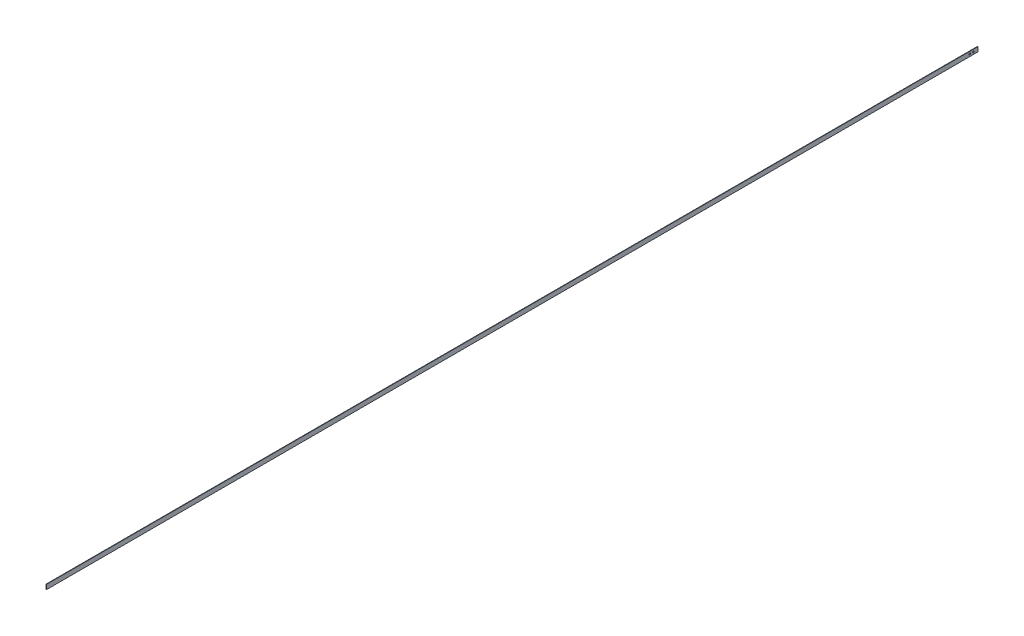
ISO-10303-21;
HEADER;
FILE_DESCRIPTION(('STEP AP214'),'2;1');
FILE_NAME('part.step','',(''),(''),'','','');
FILE_SCHEMA(('AUTOMOTIVE_DESIGN { 1 0 10303 214 1 1 1 1 }'));
ENDSEC;
DATA;
#1=APPLICATION_CONTEXT('core data for automotive mechanical design processes');
#2=APPLICATION_PROTOCOL_DEFINITION('international standard','automotive_design',2000,#1);
#3=PRODUCT_CONTEXT('',#1,'mechanical');
#4=PRODUCT('Part','Part','',(#3));
#5=PRODUCT_RELATED_PRODUCT_CATEGORY('part','',(#4));
#6=PRODUCT_DEFINITION_FORMATION('','',#4);
#7=PRODUCT_DEFINITION_CONTEXT('part definition',#1,'design');
#8=PRODUCT_DEFINITION('design','',#6,#7);
#9=PRODUCT_DEFINITION_SHAPE('','',#8);
#10=(LENGTH_UNIT() NAMED_UNIT(*) SI_UNIT(.MILLI.,.METRE.));
#11=(NAMED_UNIT(*) PLANE_ANGLE_UNIT() SI_UNIT($,.RADIAN.));
#12=(NAMED_UNIT(*) SI_UNIT($,.STERADIAN.) SOLID_ANGLE_UNIT());
#13=UNCERTAINTY_MEASURE_WITH_UNIT(LENGTH_MEASURE(1.E-05),#10,'distance_accuracy_value','');
#14=(GEOMETRIC_REPRESENTATION_CONTEXT(3) GLOBAL_UNCERTAINTY_ASSIGNED_CONTEXT((#13)) GLOBAL_UNIT_ASSIGNED_CONTEXT((#10,
#11,#12)) REPRESENTATION_CONTEXT('',''));
#15=CARTESIAN_POINT('',(0.,0.,0.));
#16=DIRECTION('',(0.,0.,1.));
#17=DIRECTION('',(1.,0.,0.));
#18=AXIS2_PLACEMENT_3D('',#15,#16,#17);
#19=CARTESIAN_POINT('',(0.15,-1.5,610.));
#20=DIRECTION('',(-1.,0.,0.));
#21=DIRECTION('',(0.,0.,1.));
#22=AXIS2_PLACEMENT_3D('',#19,#20,#21);
#23=PLANE('',#22);
#24=CARTESIAN_POINT('',(0.150000000000001,0.,5.5));
#25=DIRECTION('',(1.,0.,0.));
#26=DIRECTION('',(0.,0.,-1.));
#27=AXIS2_PLACEMENT_3D('',#24,#25,#26);
#28=CIRCLE('',#27,0.499999999999988);
#29=CARTESIAN_POINT('',(0.150000000000001,0.,5.00000000000001));
#30=VERTEX_POINT('',#29);
#31=EDGE_CURVE('E117',#30,#30,#28,.T.);
#32=ORIENTED_EDGE('',*,*,#31,.F.);
#33=EDGE_LOOP('',(#32));
#34=FACE_BOUND('',#33,.T.);
#35=CARTESIAN_POINT('',(0.150000000000001,0.,3.));
#36=DIRECTION('',(1.,0.,0.));
#37=DIRECTION('',(0.,0.,-1.));
#38=AXIS2_PLACEMENT_3D('',#35,#36,#37);
#39=CIRCLE('',#38,0.499999999999988);
#40=CARTESIAN_POINT('',(0.150000000000001,0.,2.50000000000001));
#41=VERTEX_POINT('',#40);
#42=EDGE_CURVE('E111',#41,#41,#39,.T.);
#43=ORIENTED_EDGE('',*,*,#42,.F.);
#44=EDGE_LOOP('',(#43));
#45=FACE_BOUND('',#44,.T.);
#46=DIRECTION('',(0.,1.,0.));
#47=VECTOR('',#46,1.);
#48=CARTESIAN_POINT('',(0.15,-1.5,0.));
#49=LINE('',#48,#47);
#50=CARTESIAN_POINT('',(0.15,-1.5,0.));
#51=VERTEX_POINT('',#50);
#52=CARTESIAN_POINT('',(0.15,1.5,0.));
#53=VERTEX_POINT('',#52);
#54=EDGE_CURVE('E95',#51,#53,#49,.T.);
#55=ORIENTED_EDGE('',*,*,#54,.T.);
#56=DIRECTION('',(0.,0.,-1.));
#57=VECTOR('',#56,1.);
#58=CARTESIAN_POINT('',(0.15,1.5,610.));
#59=LINE('',#58,#57);
#60=CARTESIAN_POINT('',(0.15,1.5,610.));
#61=VERTEX_POINT('',#60);
#62=EDGE_CURVE('E11',#61,#53,#59,.T.);
#63=ORIENTED_EDGE('',*,*,#62,.F.);
#64=DIRECTION('',(0.,1.,0.));
#65=VECTOR('',#64,1.);
#66=CARTESIAN_POINT('',(0.15,-1.5,610.));
#67=LINE('',#66,#65);
#68=CARTESIAN_POINT('',(0.15,-1.5,610.));
#69=VERTEX_POINT('',#68);
#70=EDGE_CURVE('E83',#69,#61,#67,.T.);
#71=ORIENTED_EDGE('',*,*,#70,.F.);
#72=DIRECTION('',(0.,0.,-1.));
#73=VECTOR('',#72,1.);
#74=CARTESIAN_POINT('',(0.15,-1.5,610.));
#75=LINE('',#74,#73);
#76=EDGE_CURVE('E91',#69,#51,#75,.T.);
#77=ORIENTED_EDGE('',*,*,#76,.T.);
#78=EDGE_LOOP('',(#55,#63,#71,#77));
#79=FACE_BOUND('',#78,.T.);
#80=ADVANCED_FACE('F32',(#34,#45,#79),#23,.F.);
#81=CARTESIAN_POINT('',(-0.15,1.5,610.));
#82=DIRECTION('',(0.,-1.,0.));
#83=DIRECTION('',(0.,0.,-1.));
#84=AXIS2_PLACEMENT_3D('',#81,#82,#83);
#85=PLANE('',#84);
#86=DIRECTION('',(-1.,0.,0.));
#87=VECTOR('',#86,1.);
#88=CARTESIAN_POINT('',(-0.15,1.5,0.));
#89=LINE('',#88,#87);
#90=CARTESIAN_POINT('',(-0.15,1.5,0.));
#91=VERTEX_POINT('',#90);
#92=EDGE_CURVE('E87',#53,#91,#89,.T.);
#93=ORIENTED_EDGE('',*,*,#92,.T.);
#94=DIRECTION('',(0.,0.,-1.));
#95=VECTOR('',#94,1.);
#96=CARTESIAN_POINT('',(-0.15,1.5,610.));
#97=LINE('',#96,#95);
#98=CARTESIAN_POINT('',(-0.15,1.5,610.));
#99=VERTEX_POINT('',#98);
#100=EDGE_CURVE('E40',#99,#91,#97,.T.);
#101=ORIENTED_EDGE('',*,*,#100,.F.);
#102=DIRECTION('',(-1.,0.,0.));
#103=VECTOR('',#102,1.);
#104=CARTESIAN_POINT('',(-0.15,1.5,610.));
#105=LINE('',#104,#103);
#106=EDGE_CURVE('E78',#61,#99,#105,.T.);
#107=ORIENTED_EDGE('',*,*,#106,.F.);
#108=ORIENTED_EDGE('',*,*,#62,.T.);
#109=EDGE_LOOP('',(#93,#101,#107,#108));
#110=FACE_BOUND('',#109,.T.);
#111=ADVANCED_FACE('F86',(#110),#85,.F.);
#112=CARTESIAN_POINT('',(-0.15,-1.5,610.));
#113=DIRECTION('',(1.,0.,0.));
#114=DIRECTION('',(0.,0.,-1.));
#115=AXIS2_PLACEMENT_3D('',#112,#113,#114);
#116=PLANE('',#115);
#117=CARTESIAN_POINT('',(-0.15,0.,5.5));
#118=DIRECTION('',(1.,0.,0.));
#119=DIRECTION('',(0.,0.,-1.));
#120=AXIS2_PLACEMENT_3D('',#117,#118,#119);
#121=CIRCLE('',#120,0.499999999999999);
#122=CARTESIAN_POINT('',(-0.15,0.,5.));
#123=VERTEX_POINT('',#122);
#124=EDGE_CURVE('E114',#123,#123,#121,.T.);
#125=ORIENTED_EDGE('',*,*,#124,.T.);
#126=EDGE_LOOP('',(#125));
#127=FACE_BOUND('',#126,.T.);
#128=CARTESIAN_POINT('',(-0.15,0.,3.));
#129=DIRECTION('',(1.,0.,0.));
#130=DIRECTION('',(0.,0.,-1.));
#131=AXIS2_PLACEMENT_3D('',#128,#129,#130);
#132=CIRCLE('',#131,0.499999999999999);
#133=CARTESIAN_POINT('',(-0.15,0.,2.5));
#134=VERTEX_POINT('',#133);
#135=EDGE_CURVE('E98',#134,#134,#132,.T.);
#136=ORIENTED_EDGE('',*,*,#135,.T.);
#137=EDGE_LOOP('',(#136));
#138=FACE_BOUND('',#137,.T.);
#139=DIRECTION('',(0.,-1.,0.));
#140=VECTOR('',#139,1.);
#141=CARTESIAN_POINT('',(-0.15,-1.5,0.));
#142=LINE('',#141,#140);
#143=CARTESIAN_POINT('',(-0.15,-1.5,0.));
#144=VERTEX_POINT('',#143);
#145=EDGE_CURVE('E65',#91,#144,#142,.T.);
#146=ORIENTED_EDGE('',*,*,#145,.T.);
#147=DIRECTION('',(0.,0.,-1.));
#148=VECTOR('',#147,1.);
#149=CARTESIAN_POINT('',(-0.15,-1.5,610.));
#150=LINE('',#149,#148);
#151=CARTESIAN_POINT('',(-0.15,-1.5,610.));
#152=VERTEX_POINT('',#151);
#153=EDGE_CURVE('E88',#152,#144,#150,.T.);
#154=ORIENTED_EDGE('',*,*,#153,.F.);
#155=DIRECTION('',(0.,-1.,0.));
#156=VECTOR('',#155,1.);
#157=CARTESIAN_POINT('',(-0.15,-1.5,610.));
#158=LINE('',#157,#156);
#159=EDGE_CURVE('E81',#99,#152,#158,.T.);
#160=ORIENTED_EDGE('',*,*,#159,.F.);
#161=ORIENTED_EDGE('',*,*,#100,.T.);
#162=EDGE_LOOP('',(#146,#154,#160,#161));
#163=FACE_BOUND('',#162,.T.);
#164=ADVANCED_FACE('F89',(#127,#138,#163),#116,.F.);
#165=CARTESIAN_POINT('',(-0.15,-1.5,610.));
#166=DIRECTION('',(0.,1.,0.));
#167=DIRECTION('',(0.,0.,1.));
#168=AXIS2_PLACEMENT_3D('',#165,#166,#167);
#169=PLANE('',#168);
#170=DIRECTION('',(1.,0.,0.));
#171=VECTOR('',#170,1.);
#172=CARTESIAN_POINT('',(-0.15,-1.5,0.));
#173=LINE('',#172,#171);
#174=EDGE_CURVE('E71',#144,#51,#173,.T.);
#175=ORIENTED_EDGE('',*,*,#174,.T.);
#176=ORIENTED_EDGE('',*,*,#76,.F.);
#177=DIRECTION('',(1.,0.,0.));
#178=VECTOR('',#177,1.);
#179=CARTESIAN_POINT('',(-0.15,-1.5,610.));
#180=LINE('',#179,#178);
#181=EDGE_CURVE('E48',#152,#69,#180,.T.);
#182=ORIENTED_EDGE('',*,*,#181,.F.);
#183=ORIENTED_EDGE('',*,*,#153,.T.);
#184=EDGE_LOOP('',(#175,#176,#182,#183));
#185=FACE_BOUND('',#184,.T.);
#186=ADVANCED_FACE('F103',(#185),#169,.F.);
#187=CARTESIAN_POINT('',(0.,0.,610.));
#188=DIRECTION('',(0.,0.,-1.));
#189=DIRECTION('',(-1.,0.,0.));
#190=AXIS2_PLACEMENT_3D('',#187,#188,#189);
#191=PLANE('',#190);
#192=ORIENTED_EDGE('',*,*,#70,.T.);
#193=ORIENTED_EDGE('',*,*,#106,.T.);
#194=ORIENTED_EDGE('',*,*,#159,.T.);
#195=ORIENTED_EDGE('',*,*,#181,.T.);
#196=EDGE_LOOP('',(#192,#193,#194,#195));
#197=FACE_BOUND('',#196,.T.);
#198=ADVANCED_FACE('F79',(#197),#191,.F.);
#199=CARTESIAN_POINT('',(0.,0.,0.));
#200=DIRECTION('',(0.,0.,-1.));
#201=DIRECTION('',(-1.,0.,0.));
#202=AXIS2_PLACEMENT_3D('',#199,#200,#201);
#203=PLANE('',#202);
#204=ORIENTED_EDGE('',*,*,#54,.F.);
#205=ORIENTED_EDGE('',*,*,#174,.F.);
#206=ORIENTED_EDGE('',*,*,#145,.F.);
#207=ORIENTED_EDGE('',*,*,#92,.F.);
#208=EDGE_LOOP('',(#204,#205,#206,#207));
#209=FACE_BOUND('',#208,.T.);
#210=ADVANCED_FACE('F106',(#209),#203,.T.);
#211=CARTESIAN_POINT('',(0.15,0.,3.));
#212=DIRECTION('',(1.,0.,0.));
#213=DIRECTION('',(0.,0.,-1.));
#214=AXIS2_PLACEMENT_3D('',#211,#212,#213);
#215=CYLINDRICAL_SURFACE('',#214,0.499999999999994);
#216=ORIENTED_EDGE('',*,*,#135,.F.);
#217=EDGE_LOOP('',(#216));
#218=FACE_BOUND('',#217,.T.);
#219=ORIENTED_EDGE('',*,*,#42,.T.);
#220=EDGE_LOOP('',(#219));
#221=FACE_BOUND('',#220,.T.);
#222=ADVANCED_FACE('F127',(#218,#221),#215,.F.);
#223=CARTESIAN_POINT('',(0.15,0.,5.5));
#224=DIRECTION('',(1.,0.,0.));
#225=DIRECTION('',(0.,0.,-1.));
#226=AXIS2_PLACEMENT_3D('',#223,#224,#225);
#227=CYLINDRICAL_SURFACE('',#226,0.499999999999994);
#228=ORIENTED_EDGE('',*,*,#124,.F.);
#229=EDGE_LOOP('',(#228));
#230=FACE_BOUND('',#229,.T.);
#231=ORIENTED_EDGE('',*,*,#31,.T.);
#232=EDGE_LOOP('',(#231));
#233=FACE_BOUND('',#232,.T.);
#234=ADVANCED_FACE('F121',(#230,#233),#227,.F.);
#235=CLOSED_SHELL('',(#80,#111,#164,#186,#198,#210,#222,#234));
#236=MANIFOLD_SOLID_BREP('B2',#235);
#237=ADVANCED_BREP_SHAPE_REPRESENTATION('',(#18,#236),#14);
#238=SHAPE_DEFINITION_REPRESENTATION(#9,#237);
ENDSEC;
END-ISO-10303-21;
